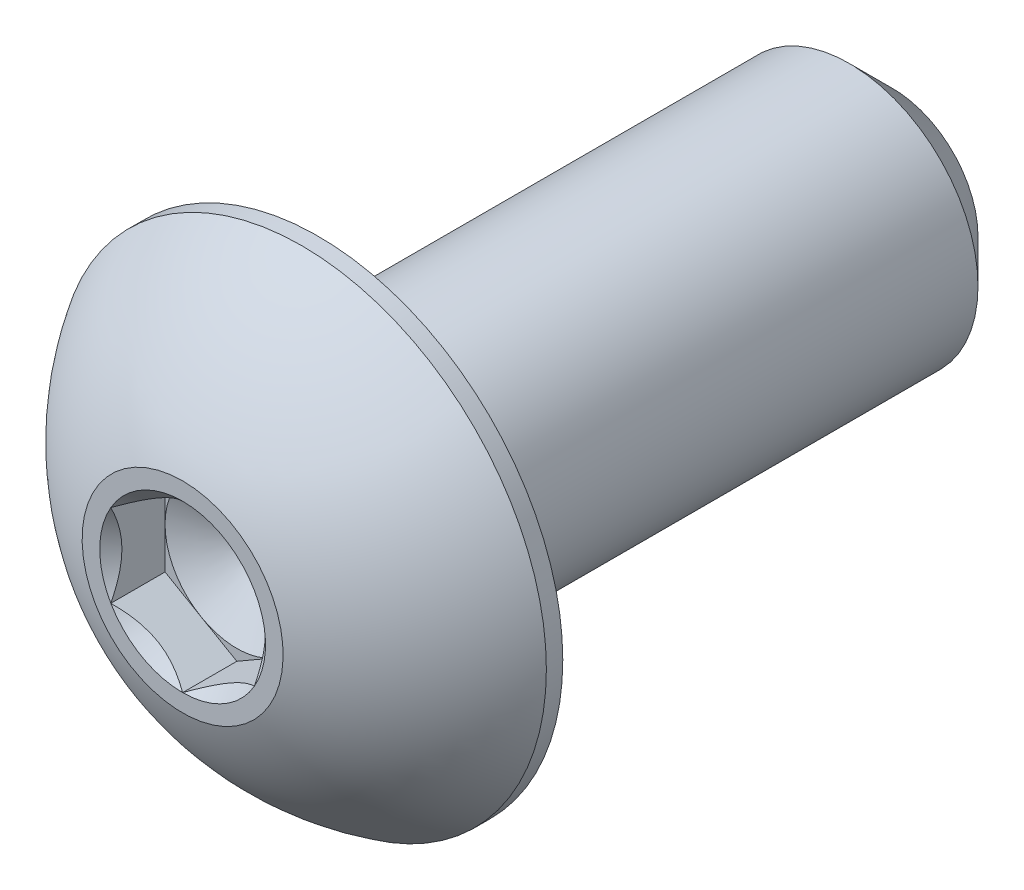
ISO-10303-21;
HEADER;
FILE_DESCRIPTION(('STEP AP214'),'2;1');
FILE_NAME('part.step','',(''),(''),'','','');
FILE_SCHEMA(('AUTOMOTIVE_DESIGN { 1 0 10303 214 1 1 1 1 }'));
ENDSEC;
DATA;
#1=APPLICATION_CONTEXT('core data for automotive mechanical design processes');
#2=APPLICATION_PROTOCOL_DEFINITION('international standard','automotive_design',2000,#1);
#3=PRODUCT_CONTEXT('',#1,'mechanical');
#4=PRODUCT('Part','Part','',(#3));
#5=PRODUCT_RELATED_PRODUCT_CATEGORY('part','',(#4));
#6=PRODUCT_DEFINITION_FORMATION('','',#4);
#7=PRODUCT_DEFINITION_CONTEXT('part definition',#1,'design');
#8=PRODUCT_DEFINITION('design','',#6,#7);
#9=PRODUCT_DEFINITION_SHAPE('','',#8);
#10=(LENGTH_UNIT() NAMED_UNIT(*) SI_UNIT(.MILLI.,.METRE.));
#11=(NAMED_UNIT(*) PLANE_ANGLE_UNIT() SI_UNIT($,.RADIAN.));
#12=(NAMED_UNIT(*) SI_UNIT($,.STERADIAN.) SOLID_ANGLE_UNIT());
#13=UNCERTAINTY_MEASURE_WITH_UNIT(LENGTH_MEASURE(1.E-05),#10,'distance_accuracy_value','');
#14=(GEOMETRIC_REPRESENTATION_CONTEXT(3) GLOBAL_UNCERTAINTY_ASSIGNED_CONTEXT((#13)) GLOBAL_UNIT_ASSIGNED_CONTEXT((#10,
#11,#12)) REPRESENTATION_CONTEXT('',''));
#15=CARTESIAN_POINT('',(0.,0.,0.));
#16=DIRECTION('',(0.,0.,1.));
#17=DIRECTION('',(1.,0.,0.));
#18=AXIS2_PLACEMENT_3D('',#15,#16,#17);
#19=CARTESIAN_POINT('',(0.,0.79375,3.9243));
#20=DIRECTION('',(0.,0.,-1.));
#21=DIRECTION('',(-1.,0.,0.));
#22=AXIS2_PLACEMENT_3D('',#19,#20,#21);
#23=PLANE('',#22);
#24=CARTESIAN_POINT('',(0.,0.,3.9243));
#25=DIRECTION('',(0.,0.,1.));
#26=DIRECTION('',(1.,0.,0.));
#27=AXIS2_PLACEMENT_3D('',#24,#25,#26);
#28=CIRCLE('',#27,1.11125);
#29=CARTESIAN_POINT('',(0.,1.11125,3.9243));
#30=VERTEX_POINT('',#29);
#31=EDGE_CURVE('E171',#30,#30,#28,.T.);
#32=ORIENTED_EDGE('',*,*,#31,.T.);
#33=EDGE_LOOP('',(#32));
#34=FACE_BOUND('',#33,.T.);
#35=CARTESIAN_POINT('',(0.,0.,3.9243));
#36=DIRECTION('',(0.,0.,1.));
#37=DIRECTION('',(1.,0.,0.));
#38=AXIS2_PLACEMENT_3D('',#35,#36,#37);
#39=CIRCLE('',#38,0.916543552338531);
#40=CARTESIAN_POINT('',(0.,0.916543552338531,3.9243));
#41=VERTEX_POINT('',#40);
#42=CARTESIAN_POINT('',(-0.79375,0.458271776169265,3.9243));
#43=VERTEX_POINT('',#42);
#44=EDGE_CURVE('E125',#41,#43,#39,.T.);
#45=ORIENTED_EDGE('',*,*,#44,.F.);
#46=CARTESIAN_POINT('',(0.,0.,3.9243));
#47=DIRECTION('',(0.,0.,1.));
#48=DIRECTION('',(1.,0.,0.));
#49=AXIS2_PLACEMENT_3D('',#46,#47,#48);
#50=CIRCLE('',#49,0.916543552338531);
#51=CARTESIAN_POINT('',(0.79375,0.458271776169266,3.9243));
#52=VERTEX_POINT('',#51);
#53=EDGE_CURVE('E110',#52,#41,#50,.T.);
#54=ORIENTED_EDGE('',*,*,#53,.F.);
#55=CARTESIAN_POINT('',(0.,0.,3.9243));
#56=DIRECTION('',(0.,0.,1.));
#57=DIRECTION('',(1.,0.,0.));
#58=AXIS2_PLACEMENT_3D('',#55,#56,#57);
#59=CIRCLE('',#58,0.916543552338531);
#60=CARTESIAN_POINT('',(0.79375,-0.458271776169265,3.9243));
#61=VERTEX_POINT('',#60);
#62=EDGE_CURVE('E121',#61,#52,#59,.T.);
#63=ORIENTED_EDGE('',*,*,#62,.F.);
#64=CARTESIAN_POINT('',(0.,0.,3.9243));
#65=DIRECTION('',(0.,0.,1.));
#66=DIRECTION('',(1.,0.,0.));
#67=AXIS2_PLACEMENT_3D('',#64,#65,#66);
#68=CIRCLE('',#67,0.916543552338531);
#69=CARTESIAN_POINT('',(0.,-0.916543552338531,3.9243));
#70=VERTEX_POINT('',#69);
#71=EDGE_CURVE('E142',#70,#61,#68,.T.);
#72=ORIENTED_EDGE('',*,*,#71,.F.);
#73=CARTESIAN_POINT('',(0.,0.,3.9243));
#74=DIRECTION('',(0.,0.,1.));
#75=DIRECTION('',(1.,0.,0.));
#76=AXIS2_PLACEMENT_3D('',#73,#74,#75);
#77=CIRCLE('',#76,0.916543552338531);
#78=CARTESIAN_POINT('',(-0.79375,-0.458271776169266,3.9243));
#79=VERTEX_POINT('',#78);
#80=EDGE_CURVE('E442',#79,#70,#77,.T.);
#81=ORIENTED_EDGE('',*,*,#80,.F.);
#82=CARTESIAN_POINT('',(0.,0.,3.9243));
#83=DIRECTION('',(0.,0.,1.));
#84=DIRECTION('',(1.,0.,0.));
#85=AXIS2_PLACEMENT_3D('',#82,#83,#84);
#86=CIRCLE('',#85,0.916543552338531);
#87=EDGE_CURVE('E451',#43,#79,#86,.T.);
#88=ORIENTED_EDGE('',*,*,#87,.F.);
#89=EDGE_LOOP('',(#45,#54,#63,#72,#81,#88));
#90=FACE_BOUND('',#89,.T.);
#91=ADVANCED_FACE('F37',(#34,#90),#23,.F.);
#92=CARTESIAN_POINT('',(0.,0.,-3.9243));
#93=DIRECTION('',(0.,0.,1.));
#94=DIRECTION('',(1.,0.,0.));
#95=AXIS2_PLACEMENT_3D('',#92,#93,#94);
#96=CONICAL_SURFACE('',#95,0.946150000000002,0.785398163397447);
#97=CARTESIAN_POINT('',(0.,0.,-3.44805));
#98=DIRECTION('',(0.,0.,1.));
#99=DIRECTION('',(1.,0.,0.));
#100=AXIS2_PLACEMENT_3D('',#97,#98,#99);
#101=CIRCLE('',#100,1.4224);
#102=CARTESIAN_POINT('',(1.4224,0.,-3.44805));
#103=VERTEX_POINT('',#102);
#104=EDGE_CURVE('E11',#103,#103,#101,.T.);
#105=ORIENTED_EDGE('',*,*,#104,.F.);
#106=EDGE_LOOP('',(#105));
#107=FACE_BOUND('',#106,.T.);
#108=CARTESIAN_POINT('',(0.,0.,-3.9243));
#109=DIRECTION('',(0.,0.,1.));
#110=DIRECTION('',(1.,0.,0.));
#111=AXIS2_PLACEMENT_3D('',#108,#109,#110);
#112=CIRCLE('',#111,0.946150000000002);
#113=CARTESIAN_POINT('',(0.946150000000002,0.,-3.9243));
#114=VERTEX_POINT('',#113);
#115=EDGE_CURVE('E164',#114,#114,#112,.T.);
#116=ORIENTED_EDGE('',*,*,#115,.T.);
#117=EDGE_LOOP('',(#116));
#118=FACE_BOUND('',#117,.T.);
#119=ADVANCED_FACE('F39',(#107,#118),#96,.T.);
#120=CARTESIAN_POINT('',(0.,0.,3.9243));
#121=DIRECTION('',(0.,0.,1.));
#122=DIRECTION('',(1.,0.,0.));
#123=AXIS2_PLACEMENT_3D('',#120,#121,#122);
#124=CYLINDRICAL_SURFACE('',#123,1.4224);
#125=CARTESIAN_POINT('',(0.,0.,2.4257));
#126=DIRECTION('',(0.,0.,1.));
#127=DIRECTION('',(1.,0.,0.));
#128=AXIS2_PLACEMENT_3D('',#125,#126,#127);
#129=CIRCLE('',#128,1.4224);
#130=CARTESIAN_POINT('',(1.4224,0.,2.4257));
#131=VERTEX_POINT('',#130);
#132=EDGE_CURVE('E45',#131,#131,#129,.T.);
#133=ORIENTED_EDGE('',*,*,#132,.F.);
#134=EDGE_LOOP('',(#133));
#135=FACE_BOUND('',#134,.T.);
#136=ORIENTED_EDGE('',*,*,#104,.T.);
#137=EDGE_LOOP('',(#136));
#138=FACE_BOUND('',#137,.T.);
#139=ADVANCED_FACE('F185',(#135,#138),#124,.T.);
#140=CARTESIAN_POINT('',(0.,2.7051,2.4257));
#141=DIRECTION('',(0.,0.,1.));
#142=DIRECTION('',(1.,0.,0.));
#143=AXIS2_PLACEMENT_3D('',#140,#141,#142);
#144=PLANE('',#143);
#145=CARTESIAN_POINT('',(0.,0.,2.4257));
#146=DIRECTION('',(0.,0.,1.));
#147=DIRECTION('',(1.,0.,0.));
#148=AXIS2_PLACEMENT_3D('',#145,#146,#147);
#149=CIRCLE('',#148,2.7051);
#150=CARTESIAN_POINT('',(2.7051,0.,2.4257));
#151=VERTEX_POINT('',#150);
#152=EDGE_CURVE('E178',#151,#151,#149,.T.);
#153=ORIENTED_EDGE('',*,*,#152,.F.);
#154=EDGE_LOOP('',(#153));
#155=FACE_BOUND('',#154,.T.);
#156=ORIENTED_EDGE('',*,*,#132,.T.);
#157=EDGE_LOOP('',(#156));
#158=FACE_BOUND('',#157,.T.);
#159=ADVANCED_FACE('F183',(#155,#158),#144,.F.);
#160=CARTESIAN_POINT('',(0.,0.,3.9243));
#161=DIRECTION('',(0.,0.,1.));
#162=DIRECTION('',(1.,0.,0.));
#163=AXIS2_PLACEMENT_3D('',#160,#161,#162);
#164=CYLINDRICAL_SURFACE('',#163,2.7051);
#165=CARTESIAN_POINT('',(0.,0.,2.60712857142857));
#166=DIRECTION('',(0.,0.,1.));
#167=DIRECTION('',(1.,0.,0.));
#168=AXIS2_PLACEMENT_3D('',#165,#166,#167);
#169=CIRCLE('',#168,2.7051);
#170=CARTESIAN_POINT('',(0.,2.7051,2.60712857142857));
#171=VERTEX_POINT('',#170);
#172=EDGE_CURVE('E175',#171,#171,#169,.T.);
#173=ORIENTED_EDGE('',*,*,#172,.F.);
#174=EDGE_LOOP('',(#173));
#175=FACE_BOUND('',#174,.T.);
#176=ORIENTED_EDGE('',*,*,#152,.T.);
#177=EDGE_LOOP('',(#176));
#178=FACE_BOUND('',#177,.T.);
#179=ADVANCED_FACE('F204',(#175,#178),#164,.T.);
#180=CARTESIAN_POINT('',(0.,0.,0.956717402105471));
#181=DIRECTION('',(0.,0.,1.));
#182=DIRECTION('',(0.,1.,0.));
#183=AXIS2_PLACEMENT_3D('',#180,#181,#182);
#184=SPHERICAL_SURFACE('',#183,3.16882044897253);
#185=CARTESIAN_POINT('',(0.,1.11125,3.9243));
#186=CARTESIAN_POINT('',(0.,1.13179667759226,3.9166060663439));
#187=CARTESIAN_POINT('',(0.,1.15226342355972,3.90869867966255));
#188=CARTESIAN_POINT('',(0.,1.19302827978612,3.89246055572916));
#189=CARTESIAN_POINT('',(0.,1.21332639004505,3.88412981847711));
#190=CARTESIAN_POINT('',(0.,1.25374520239545,3.86704854888208));
#191=CARTESIAN_POINT('',(0.,1.27386590448691,3.8582980165391));
#192=CARTESIAN_POINT('',(0.,1.31392122407572,3.84038094229067));
#193=CARTESIAN_POINT('',(0.,1.33385584157306,3.83121440038521));
#194=CARTESIAN_POINT('',(0.,1.37353039060482,3.81246925890343));
#195=CARTESIAN_POINT('',(0.,1.39327032213924,3.80289065932711));
#196=CARTESIAN_POINT('',(0.,1.43254698326807,3.78332553568027));
#197=CARTESIAN_POINT('',(0.,1.45208371286248,3.77333901160976));
#198=CARTESIAN_POINT('',(0.,1.49094554142533,3.75296234719803));
#199=CARTESIAN_POINT('',(0.,1.51027064039377,3.7425722068568));
#200=CARTESIAN_POINT('',(0.,1.54870087042163,3.72139279250897));
#201=CARTESIAN_POINT('',(0.,1.56780600148105,3.71060351850236));
#202=CARTESIAN_POINT('',(0.,1.60578805328026,3.6886304915572));
#203=CARTESIAN_POINT('',(0.,1.62466497402005,3.67744673861865));
#204=CARTESIAN_POINT('',(0.,1.66218246123194,3.65468957874866));
#205=CARTESIAN_POINT('',(0.,1.68082302770403,3.64311617181724));
#206=CARTESIAN_POINT('',(0.,1.71785976439932,3.61958469700166));
#207=CARTESIAN_POINT('',(0.,1.73625593462253,3.60762662911752));
#208=CARTESIAN_POINT('',(0.,1.77279594227768,3.5833309913898));
#209=CARTESIAN_POINT('',(0.,1.79093977970964,3.57099342154623));
#210=CARTESIAN_POINT('',(0.,1.82696729410213,3.5459441026187));
#211=CARTESIAN_POINT('',(0.,1.84485097106267,3.53323235353474));
#212=CARTESIAN_POINT('',(0.,1.88035044907158,3.50744016027535));
#213=CARTESIAN_POINT('',(0.,1.89796625011995,3.49435971609992));
#214=CARTESIAN_POINT('',(0.,1.93292237643174,3.46783577587022));
#215=CARTESIAN_POINT('',(0.,1.95026270169517,3.45439227981596));
#216=CARTESIAN_POINT('',(0.,1.98466039541108,3.42714803567043));
#217=CARTESIAN_POINT('',(0.,2.00171776386356,3.41334728757917));
#218=CARTESIAN_POINT('',(0.,2.03554218500583,3.38539449332841));
#219=CARTESIAN_POINT('',(0.,2.05230923769562,3.37124244716892));
#220=CARTESIAN_POINT('',(0.,2.08554579360982,3.3425931623088));
#221=CARTESIAN_POINT('',(0.,2.10201529683424,3.32809592360816));
#222=CARTESIAN_POINT('',(0.,2.13464964848491,3.29876250811703));
#223=CARTESIAN_POINT('',(0.,2.15081449691115,3.28392633132654));
#224=CARTESIAN_POINT('',(0.,2.18283256506795,3.25392144033288));
#225=CARTESIAN_POINT('',(0.,2.19868578479851,3.23875272612972));
#226=CARTESIAN_POINT('',(0.,2.23007375611036,3.2080893044524));
#227=CARTESIAN_POINT('',(0.,2.24560850769166,3.19259459697825));
#228=CARTESIAN_POINT('',(0.,2.27635284064621,3.16128587354188));
#229=CARTESIAN_POINT('',(0.,2.29156242201947,3.14547185757967));
#230=CARTESIAN_POINT('',(0.,2.32164985278493,3.11353133970713));
#231=CARTESIAN_POINT('',(0.,2.33652770217713,3.0974048377968));
#232=CARTESIAN_POINT('',(0.,2.3659452503257,3.06484630538257));
#233=CARTESIAN_POINT('',(0.,2.38048494908206,3.04841427487866));
#234=CARTESIAN_POINT('',(0.,2.40921992318589,3.01525177444122));
#235=CARTESIAN_POINT('',(0.,2.42341519853336,2.9985213045077));
#236=CARTESIAN_POINT('',(0.,2.45145520165522,2.96476914313931));
#237=CARTESIAN_POINT('',(0.,2.4652999294296,2.94774745170446));
#238=CARTESIAN_POINT('',(0.,2.49263286441426,2.91342019086236));
#239=CARTESIAN_POINT('',(0.,2.50612107162454,2.89611462145512));
#240=CARTESIAN_POINT('',(0.,2.53273514653018,2.86122707081507));
#241=CARTESIAN_POINT('',(0.,2.54586101422555,2.84364508958227));
#242=CARTESIAN_POINT('',(0.,2.57174474661843,2.80821230014283));
#243=CARTESIAN_POINT('',(0.,2.58450261131594,2.7903614919362));
#244=CARTESIAN_POINT('',(0.,2.60964483618243,2.75439875141566));
#245=CARTESIAN_POINT('',(0.,2.62202919635141,2.73628681910174));
#246=CARTESIAN_POINT('',(0.,2.64641905987448,2.69980963828797));
#247=CARTESIAN_POINT('',(0.,2.65842456322856,2.68144438978811));
#248=CARTESIAN_POINT('',(0.,2.68205156867364,2.64446852217512));
#249=CARTESIAN_POINT('',(0.,2.69367307076464,2.62585790306199));
#250=CARTESIAN_POINT('',(0.,2.7051,2.60712857142857));
#251=B_SPLINE_CURVE_WITH_KNOTS('',3,(#185,#186,#187,#188,#189,#190,#191,#192,#193,#194,#195,
#196,#197,#198,#199,#200,#201,#202,#203,#204,#205,#206,#207,#208,#209,#210,#211,#212,#213,#214,
#215,#216,#217,#218,#219,#220,#221,#222,#223,#224,#225,#226,#227,#228,#229,#230,#231,#232,#233,
#234,#235,#236,#237,#238,#239,#240,#241,#242,#243,#244,#245,#246,#247,#248,#249,#250),
.UNSPECIFIED.,.F.,.F.,(4,2,2,2,2,2,2,2,2,2,2,2,2,2,2,2,2,2,2,2,2,2,2,2,2,2,2,2,2,2,2,2,4),(0.,
0.0658187445891959,0.131637489178392,0.197456233767589,0.263274978356786,0.329093722945982,
0.394912467535178,0.460731212124375,0.526549956713571,0.592368701302768,0.658187445891964,
0.72400619048116,0.789824935070357,0.855643679659553,0.92146242424875,0.987281168837946,
1.05309991342714,1.11891865801634,1.18473740260554,1.25055614719473,1.31637489178393,
1.38219363637312,1.44801238096232,1.51383112555152,1.57964987014071,1.64546861472991,
1.71128735931911,1.7771061039083,1.8429248484975,1.9087435930867,1.97456233767589,
2.04038108226509,2.10619982685429),.UNSPECIFIED.);
#252=EDGE_CURVE('BSEAM196',#30,#171,#251,.T.);
#253=ORIENTED_EDGE('',*,*,#31,.F.);
#254=ORIENTED_EDGE('',*,*,#172,.T.);
#255=ORIENTED_EDGE('',*,*,#252,.T.);
#256=ORIENTED_EDGE('',*,*,#252,.F.);
#257=EDGE_LOOP('',(#253,#255,#254,#256));
#258=FACE_BOUND('',#257,.T.);
#259=ADVANCED_FACE('F196',(#258),#184,.T.);
#260=CARTESIAN_POINT('',(0.,0.946150000000002,-3.9243));
#261=DIRECTION('',(0.,0.,1.));
#262=DIRECTION('',(1.,0.,0.));
#263=AXIS2_PLACEMENT_3D('',#260,#261,#262);
#264=PLANE('',#263);
#265=ORIENTED_EDGE('',*,*,#115,.F.);
#266=EDGE_LOOP('',(#265));
#267=FACE_BOUND('',#266,.T.);
#268=ADVANCED_FACE('F194',(#267),#264,.F.);
#269=CARTESIAN_POINT('',(0.79375,0.458271776169266,3.9243));
#270=DIRECTION('',(-0.499999999999999,-0.866025403784439,0.));
#271=DIRECTION('',(0.866025403784439,-0.5,0.));
#272=AXIS2_PLACEMENT_3D('',#269,#270,#271);
#273=PLANE('',#272);
#274=CARTESIAN_POINT('',(0.79395,0.458156306115428,3.9244154918722));
#275=CARTESIAN_POINT('',(0.7666563268291,0.473914315667821,3.90866677881996));
#276=CARTESIAN_POINT('',(0.738906237701708,0.489935837095556,3.89384254758418));
#277=CARTESIAN_POINT('',(0.68232025046316,0.522605772060093,3.86669903778594));
#278=CARTESIAN_POINT('',(0.653478963353311,0.539257296936739,3.85439487372838));
#279=CARTESIAN_POINT('',(0.595321679020445,0.572834420701657,3.8333173665706));
#280=CARTESIAN_POINT('',(0.56602051479722,0.589751455753505,3.82449100814755));
#281=CARTESIAN_POINT('',(0.506773157113024,0.62395793366125,3.81089123872424));
#282=CARTESIAN_POINT('',(0.476828775638362,0.641246330366363,3.80610766812998));
#283=CARTESIAN_POINT('',(0.425225377533548,0.671039566153277,3.80179340945595));
#284=CARTESIAN_POINT('',(0.403633531741488,0.683505624133623,3.80115527141097));
#285=CARTESIAN_POINT('',(0.360491632722968,0.708413611145317,3.80222613979119));
#286=CARTESIAN_POINT('',(0.338941589763515,0.720855534249006,3.80393566388179));
#287=CARTESIAN_POINT('',(0.274599154455217,0.758003656594567,3.81247279115859));
#288=CARTESIAN_POINT('',(0.232126946019305,0.782524997568119,3.82270991913679));
#289=CARTESIAN_POINT('',(0.157575609219718,0.825567231937807,3.84741858984055));
#290=CARTESIAN_POINT('',(0.125147212182333,0.844289775696729,3.86059617467531));
#291=CARTESIAN_POINT('',(0.0615608535385161,0.881001376976525,3.89028103995168));
#292=CARTESIAN_POINT('',(0.0303991453684825,0.898992597576902,3.90677748789317));
#293=CARTESIAN_POINT('',(-0.000200000000000446,0.916659022392369,3.9244154918722));
#294=B_SPLINE_CURVE_WITH_KNOTS('',3,(#274,#275,#276,#277,#278,#279,#280,#281,#282,#283,#284,
#285,#286,#287,#288,#289,#290,#291,#292,#293),.UNSPECIFIED.,.F.,.F.,(4,2,2,2,2,2,2,2,2,4),(0.,
0.105768699105621,0.21215429718622,0.316848842533858,0.421279499712345,0.495991864977073,
0.570720707151283,0.720221070373883,0.839150369964801,0.957697614118391),.UNSPECIFIED.);
#295=EDGE_CURVE('E107',#52,#41,#294,.T.);
#296=ORIENTED_EDGE('',*,*,#295,.T.);
#297=DIRECTION('',(0.,0.,-1.));
#298=VECTOR('',#297,1.);
#299=CARTESIAN_POINT('',(0.,0.916543552338531,3.9243));
#300=LINE('',#299,#298);
#301=CARTESIAN_POINT('',(0.,0.916543552338531,3.32486));
#302=VERTEX_POINT('',#301);
#303=EDGE_CURVE('E162',#41,#302,#300,.T.);
#304=ORIENTED_EDGE('',*,*,#303,.T.);
#305=DIRECTION('',(-0.866025403784439,0.499999999999999,0.));
#306=VECTOR('',#305,1.);
#307=CARTESIAN_POINT('',(0.79375,0.458271776169266,3.32486));
#308=LINE('',#307,#306);
#309=CARTESIAN_POINT('',(0.396875,0.687407664253898,3.32486));
#310=VERTEX_POINT('',#309);
#311=EDGE_CURVE('E478',#310,#302,#308,.T.);
#312=ORIENTED_EDGE('',*,*,#311,.F.);
#313=CARTESIAN_POINT('',(0.79375,0.458271776169266,3.32486));
#314=VERTEX_POINT('',#313);
#315=EDGE_CURVE('E52',#314,#310,#308,.T.);
#316=ORIENTED_EDGE('',*,*,#315,.F.);
#317=DIRECTION('',(0.,0.,-1.));
#318=VECTOR('',#317,1.);
#319=CARTESIAN_POINT('',(0.79375,0.458271776169266,3.9243));
#320=LINE('',#319,#318);
#321=EDGE_CURVE('E138',#52,#314,#320,.T.);
#322=ORIENTED_EDGE('',*,*,#321,.F.);
#323=EDGE_LOOP('',(#296,#304,#312,#316,#322));
#324=FACE_BOUND('',#323,.T.);
#325=ADVANCED_FACE('F144',(#324),#273,.T.);
#326=CARTESIAN_POINT('',(0.,0.916543552338531,3.9243));
#327=DIRECTION('',(0.5,-0.866025403784438,0.));
#328=DIRECTION('',(0.866025403784438,0.500000000000001,0.));
#329=AXIS2_PLACEMENT_3D('',#326,#327,#328);
#330=PLANE('',#329);
#331=CARTESIAN_POINT('',(0.000199999999999363,0.916659022392369,3.9244154918722));
#332=CARTESIAN_POINT('',(-0.0270936731709006,0.900901012839976,3.90866677881996));
#333=CARTESIAN_POINT('',(-0.0548437622982919,0.88487949141224,3.89384254758418));
#334=CARTESIAN_POINT('',(-0.111429749536841,0.852209556447703,3.86669903778594));
#335=CARTESIAN_POINT('',(-0.140271036646689,0.835558031571057,3.85439487372838));
#336=CARTESIAN_POINT('',(-0.198428320979556,0.801980907806139,3.8333173665706));
#337=CARTESIAN_POINT('',(-0.22772948520278,0.785063872754291,3.82449100814755));
#338=CARTESIAN_POINT('',(-0.286976842886977,0.750857394846546,3.81089123872424));
#339=CARTESIAN_POINT('',(-0.316921224361638,0.733568998141434,3.80610766812998));
#340=CARTESIAN_POINT('',(-0.368524622466453,0.703775762354519,3.80179340945595));
#341=CARTESIAN_POINT('',(-0.390116468258512,0.691309704374173,3.80115527141097));
#342=CARTESIAN_POINT('',(-0.433258367277032,0.666401717362479,3.80222613979119));
#343=CARTESIAN_POINT('',(-0.454808410236485,0.65395979425879,3.80393566388179));
#344=CARTESIAN_POINT('',(-0.519150845544783,0.616811671913228,3.81247279115859));
#345=CARTESIAN_POINT('',(-0.561623053980696,0.592290330939676,3.82270991913679));
#346=CARTESIAN_POINT('',(-0.636174390780282,0.549248096569989,3.84741858984055));
#347=CARTESIAN_POINT('',(-0.668602787817667,0.530525552811066,3.86059617467531));
#348=CARTESIAN_POINT('',(-0.732189146461484,0.493813951531271,3.89028103995168));
#349=CARTESIAN_POINT('',(-0.763350854631517,0.475822730930893,3.90677748789317));
#350=CARTESIAN_POINT('',(-0.79395,0.458156306115427,3.9244154918722));
#351=B_SPLINE_CURVE_WITH_KNOTS('',3,(#331,#332,#333,#334,#335,#336,#337,#338,#339,#340,#341,
#342,#343,#344,#345,#346,#347,#348,#349,#350),.UNSPECIFIED.,.F.,.F.,(4,2,2,2,2,2,2,2,2,4),(0.,
0.105768699105621,0.21215429718622,0.316848842533859,0.421279499712346,0.495991864977073,
0.570720707151283,0.720221070373883,0.839150369964801,0.95769761411839),.UNSPECIFIED.);
#352=EDGE_CURVE('E466',#41,#43,#351,.T.);
#353=ORIENTED_EDGE('',*,*,#352,.T.);
#354=DIRECTION('',(0.,0.,-1.));
#355=VECTOR('',#354,1.);
#356=CARTESIAN_POINT('',(-0.79375,0.458271776169265,3.9243));
#357=LINE('',#356,#355);
#358=CARTESIAN_POINT('',(-0.79375,0.458271776169265,3.32486));
#359=VERTEX_POINT('',#358);
#360=EDGE_CURVE('E159',#43,#359,#357,.T.);
#361=ORIENTED_EDGE('',*,*,#360,.T.);
#362=DIRECTION('',(-0.866025403784438,-0.5,0.));
#363=VECTOR('',#362,1.);
#364=CARTESIAN_POINT('',(0.,0.916543552338531,3.32486));
#365=LINE('',#364,#363);
#366=CARTESIAN_POINT('',(-0.396875,0.687407664253898,3.32486));
#367=VERTEX_POINT('',#366);
#368=EDGE_CURVE('E480',#367,#359,#365,.T.);
#369=ORIENTED_EDGE('',*,*,#368,.F.);
#370=EDGE_CURVE('E481',#302,#367,#365,.T.);
#371=ORIENTED_EDGE('',*,*,#370,.F.);
#372=ORIENTED_EDGE('',*,*,#303,.F.);
#373=EDGE_LOOP('',(#353,#361,#369,#371,#372));
#374=FACE_BOUND('',#373,.T.);
#375=ADVANCED_FACE('F202',(#374),#330,.T.);
#376=CARTESIAN_POINT('',(-0.79375,0.458271776169265,3.9243));
#377=DIRECTION('',(1.,0.,0.));
#378=DIRECTION('',(0.,1.,0.));
#379=AXIS2_PLACEMENT_3D('',#376,#377,#378);
#380=PLANE('',#379);
#381=CARTESIAN_POINT('',(-0.79375,-0.886414096599244,4.19761736942916));
#382=CARTESIAN_POINT('',(-0.79375,-0.86470171419992,4.18144470678827));
#383=CARTESIAN_POINT('',(-0.79375,-0.842865388063719,4.16543885240306));
#384=CARTESIAN_POINT('',(-0.79375,-0.79889567409347,4.13382876580154));
#385=CARTESIAN_POINT('',(-0.79375,-0.776762210654221,4.11822463886703));
#386=CARTESIAN_POINT('',(-0.79375,-0.709518845973245,4.07189483271595));
#387=CARTESIAN_POINT('',(-0.79375,-0.66389615563468,4.04190094914757));
#388=CARTESIAN_POINT('',(-0.79375,-0.568400086548212,3.98326512389417));
#389=CARTESIAN_POINT('',(-0.79375,-0.518429613643662,3.95477938225233));
#390=CARTESIAN_POINT('',(-0.79375,-0.416032101977318,3.90284504880168));
#391=CARTESIAN_POINT('',(-0.79375,-0.363614070820858,3.87937952562059));
#392=CARTESIAN_POINT('',(-0.79375,-0.284656617559875,3.85068367250404));
#393=CARTESIAN_POINT('',(-0.79375,-0.259232429165401,3.84240416001904));
#394=CARTESIAN_POINT('',(-0.79375,-0.207807364053749,3.8278843748874));
#395=CARTESIAN_POINT('',(-0.79375,-0.18180644548624,3.82164425074902));
#396=CARTESIAN_POINT('',(-0.79375,-0.104000822329058,3.80670941347527));
#397=CARTESIAN_POINT('',(-0.79375,-0.0514629352178519,3.80143917525149));
#398=CARTESIAN_POINT('',(-0.79375,0.0519230063012085,3.80157298750897));
#399=CARTESIAN_POINT('',(-0.79375,0.102771763174832,3.80664351587352));
#400=CARTESIAN_POINT('',(-0.79375,0.178135386060792,3.82085873388841));
#401=CARTESIAN_POINT('',(-0.79375,0.20332427883755,3.82678165958048));
#402=CARTESIAN_POINT('',(-0.79375,0.253165828732923,3.84056036344039));
#403=CARTESIAN_POINT('',(-0.79375,0.277818539396018,3.84841594763457));
#404=CARTESIAN_POINT('',(-0.79375,0.356745861124012,3.87648863718015));
#405=CARTESIAN_POINT('',(-0.79375,0.409857837794497,3.89995804225391));
#406=CARTESIAN_POINT('',(-0.79375,0.513576140604894,3.95209685067416));
#407=CARTESIAN_POINT('',(-0.79375,0.564172447910597,3.98078520882156));
#408=CARTESIAN_POINT('',(-0.79375,0.660846745738733,4.0399268692853));
#409=CARTESIAN_POINT('',(-0.79375,0.707024109054009,4.07021975969034));
#410=CARTESIAN_POINT('',(-0.79375,0.775058121051357,4.11703034954389));
#411=CARTESIAN_POINT('',(-0.79375,0.797441820874697,4.13279526319896));
#412=CARTESIAN_POINT('',(-0.79375,0.841904444862721,4.16473700714118));
#413=CARTESIAN_POINT('',(-0.79375,0.863983450465099,4.18091372394077));
#414=CARTESIAN_POINT('',(-0.79375,0.885935743338028,4.19726105203419));
#415=B_SPLINE_CURVE_WITH_KNOTS('',3,(#381,#382,#383,#384,#385,#386,#387,#388,#389,#390,#391,
#392,#393,#394,#395,#396,#397,#398,#399,#400,#401,#402,#403,#404,#405,#406,#407,#408,#409,#410,
#411,#412,#413,#414),.UNSPECIFIED.,.F.,.F.,(4,2,2,2,2,2,2,2,2,2,2,2,2,2,2,2,4),(0.,
0.0812188387950317,0.162458750511489,0.326178806253456,0.498586653888075,0.670403531438169,
0.750543907216537,0.830690117517372,0.988028410529606,1.14037233605713,1.21793318643015,
1.29548625548648,1.46917505876894,1.64350775825017,1.80910713566105,1.89123846739721,
1.97334740474278),.UNSPECIFIED.);
#416=EDGE_CURVE('E459',#43,#79,#415,.F.);
#417=ORIENTED_EDGE('',*,*,#416,.T.);
#418=DIRECTION('',(0.,0.,-1.));
#419=VECTOR('',#418,1.);
#420=CARTESIAN_POINT('',(-0.79375,-0.458271776169266,3.9243));
#421=LINE('',#420,#419);
#422=CARTESIAN_POINT('',(-0.79375,-0.458271776169266,3.32486));
#423=VERTEX_POINT('',#422);
#424=EDGE_CURVE('E156',#79,#423,#421,.T.);
#425=ORIENTED_EDGE('',*,*,#424,.T.);
#426=DIRECTION('',(0.,-1.,0.));
#427=VECTOR('',#426,1.);
#428=CARTESIAN_POINT('',(-0.79375,0.458271776169265,3.32486));
#429=LINE('',#428,#427);
#430=CARTESIAN_POINT('',(-0.79375,0.,3.32486));
#431=VERTEX_POINT('',#430);
#432=EDGE_CURVE('E484',#431,#423,#429,.T.);
#433=ORIENTED_EDGE('',*,*,#432,.F.);
#434=EDGE_CURVE('E485',#359,#431,#429,.T.);
#435=ORIENTED_EDGE('',*,*,#434,.F.);
#436=ORIENTED_EDGE('',*,*,#360,.F.);
#437=EDGE_LOOP('',(#417,#425,#433,#435,#436));
#438=FACE_BOUND('',#437,.T.);
#439=ADVANCED_FACE('F323',(#438),#380,.T.);
#440=CARTESIAN_POINT('',(-0.79375,-0.458271776169266,3.9243));
#441=DIRECTION('',(0.499999999999999,0.866025403784439,0.));
#442=DIRECTION('',(-0.866025403784439,0.5,0.));
#443=AXIS2_PLACEMENT_3D('',#440,#441,#442);
#444=PLANE('',#443);
#445=CARTESIAN_POINT('',(-0.79395,-0.458156306115428,3.9244154918722));
#446=CARTESIAN_POINT('',(-0.7666563268291,-0.473914315667821,3.90866677881996));
#447=CARTESIAN_POINT('',(-0.738906237701709,-0.489935837095556,3.89384254758418));
#448=CARTESIAN_POINT('',(-0.68232025046316,-0.522605772060093,3.86669903778594));
#449=CARTESIAN_POINT('',(-0.653478963353312,-0.539257296936739,3.85439487372838));
#450=CARTESIAN_POINT('',(-0.595321679020445,-0.572834420701657,3.8333173665706));
#451=CARTESIAN_POINT('',(-0.56602051479722,-0.589751455753506,3.82449100814755));
#452=CARTESIAN_POINT('',(-0.506773157113024,-0.623957933661251,3.81089123872424));
#453=CARTESIAN_POINT('',(-0.476828775638362,-0.641246330366363,3.80610766812998));
#454=CARTESIAN_POINT('',(-0.425225377533548,-0.671039566153277,3.80179340945595));
#455=CARTESIAN_POINT('',(-0.403633531741488,-0.683505624133623,3.80115527141097));
#456=CARTESIAN_POINT('',(-0.360491632722968,-0.708413611145318,3.80222613979119));
#457=CARTESIAN_POINT('',(-0.338941589763515,-0.720855534249006,3.80393566388179));
#458=CARTESIAN_POINT('',(-0.274599154455217,-0.758003656594568,3.81247279115859));
#459=CARTESIAN_POINT('',(-0.232126946019305,-0.78252499756812,3.82270991913679));
#460=CARTESIAN_POINT('',(-0.157575609219718,-0.825567231937807,3.84741858984055));
#461=CARTESIAN_POINT('',(-0.125147212182333,-0.84428977569673,3.86059617467531));
#462=CARTESIAN_POINT('',(-0.0615608535385163,-0.881001376976525,3.89028103995168));
#463=CARTESIAN_POINT('',(-0.0303991453684828,-0.898992597576903,3.90677748789317));
#464=CARTESIAN_POINT('',(0.00020000000000017,-0.916659022392369,3.9244154918722));
#465=B_SPLINE_CURVE_WITH_KNOTS('',3,(#445,#446,#447,#448,#449,#450,#451,#452,#453,#454,#455,
#456,#457,#458,#459,#460,#461,#462,#463,#464),.UNSPECIFIED.,.F.,.F.,(4,2,2,2,2,2,2,2,2,4),(0.,
0.105768699105621,0.21215429718622,0.316848842533859,0.421279499712346,0.495991864977074,
0.570720707151283,0.720221070373884,0.839150369964801,0.957697614118391),.UNSPECIFIED.);
#466=EDGE_CURVE('E444',#79,#70,#465,.T.);
#467=ORIENTED_EDGE('',*,*,#466,.T.);
#468=DIRECTION('',(0.,0.,-1.));
#469=VECTOR('',#468,1.);
#470=CARTESIAN_POINT('',(0.,-0.916543552338531,3.9243));
#471=LINE('',#470,#469);
#472=CARTESIAN_POINT('',(0.,-0.916543552338531,3.32486));
#473=VERTEX_POINT('',#472);
#474=EDGE_CURVE('E147',#70,#473,#471,.T.);
#475=ORIENTED_EDGE('',*,*,#474,.T.);
#476=DIRECTION('',(0.866025403784439,-0.499999999999999,0.));
#477=VECTOR('',#476,1.);
#478=CARTESIAN_POINT('',(-0.79375,-0.458271776169266,3.32486));
#479=LINE('',#478,#477);
#480=CARTESIAN_POINT('',(-0.396875,-0.687407664253899,3.32486));
#481=VERTEX_POINT('',#480);
#482=EDGE_CURVE('E488',#481,#473,#479,.T.);
#483=ORIENTED_EDGE('',*,*,#482,.F.);
#484=EDGE_CURVE('E489',#423,#481,#479,.T.);
#485=ORIENTED_EDGE('',*,*,#484,.F.);
#486=ORIENTED_EDGE('',*,*,#424,.F.);
#487=EDGE_LOOP('',(#467,#475,#483,#485,#486));
#488=FACE_BOUND('',#487,.T.);
#489=ADVANCED_FACE('F333',(#488),#444,.T.);
#490=CARTESIAN_POINT('',(0.,-0.916543552338531,3.9243));
#491=DIRECTION('',(-0.5,0.866025403784439,0.));
#492=DIRECTION('',(-0.866025403784439,-0.5,0.));
#493=AXIS2_PLACEMENT_3D('',#490,#491,#492);
#494=PLANE('',#493);
#495=CARTESIAN_POINT('',(-0.000199999999999494,-0.916659022392369,3.9244154918722));
#496=CARTESIAN_POINT('',(0.0270936731709003,-0.900901012839976,3.90866677881996));
#497=CARTESIAN_POINT('',(0.0548437622982917,-0.884879491412241,3.89384254758418));
#498=CARTESIAN_POINT('',(0.111429749536841,-0.852209556447704,3.86669903778594));
#499=CARTESIAN_POINT('',(0.140271036646689,-0.835558031571057,3.85439487372838));
#500=CARTESIAN_POINT('',(0.198428320979556,-0.801980907806139,3.8333173665706));
#501=CARTESIAN_POINT('',(0.22772948520278,-0.785063872754291,3.82449100814755));
#502=CARTESIAN_POINT('',(0.286976842886977,-0.750857394846546,3.81089123872424));
#503=CARTESIAN_POINT('',(0.316921224361638,-0.733568998141434,3.80610766812998));
#504=CARTESIAN_POINT('',(0.368524622466453,-0.703775762354519,3.80179340945595));
#505=CARTESIAN_POINT('',(0.390116468258512,-0.691309704374173,3.80115527141097));
#506=CARTESIAN_POINT('',(0.433258367277032,-0.666401717362479,3.80222613979119));
#507=CARTESIAN_POINT('',(0.454808410236485,-0.65395979425879,3.80393566388179));
#508=CARTESIAN_POINT('',(0.519150845544784,-0.616811671913228,3.8124727911586));
#509=CARTESIAN_POINT('',(0.561623053980696,-0.592290330939676,3.82270991913679));
#510=CARTESIAN_POINT('',(0.636174390780282,-0.549248096569989,3.84741858984055));
#511=CARTESIAN_POINT('',(0.668602787817668,-0.530525552811066,3.86059617467531));
#512=CARTESIAN_POINT('',(0.732189146461484,-0.493813951531271,3.89028103995168));
#513=CARTESIAN_POINT('',(0.763350854631517,-0.475822730930894,3.90677748789317));
#514=CARTESIAN_POINT('',(0.79395,-0.458156306115427,3.9244154918722));
#515=B_SPLINE_CURVE_WITH_KNOTS('',3,(#495,#496,#497,#498,#499,#500,#501,#502,#503,#504,#505,
#506,#507,#508,#509,#510,#511,#512,#513,#514),.UNSPECIFIED.,.F.,.F.,(4,2,2,2,2,2,2,2,2,4),(0.,
0.105768699105621,0.21215429718622,0.316848842533859,0.421279499712346,0.495991864977073,
0.570720707151283,0.720221070373884,0.839150369964801,0.95769761411839),.UNSPECIFIED.);
#516=EDGE_CURVE('E435',#70,#61,#515,.T.);
#517=ORIENTED_EDGE('',*,*,#516,.T.);
#518=DIRECTION('',(0.,0.,-1.));
#519=VECTOR('',#518,1.);
#520=CARTESIAN_POINT('',(0.79375,-0.458271776169265,3.9243));
#521=LINE('',#520,#519);
#522=CARTESIAN_POINT('',(0.79375,-0.458271776169265,3.32486));
#523=VERTEX_POINT('',#522);
#524=EDGE_CURVE('E141',#61,#523,#521,.T.);
#525=ORIENTED_EDGE('',*,*,#524,.T.);
#526=DIRECTION('',(0.866025403784438,0.5,0.));
#527=VECTOR('',#526,1.);
#528=CARTESIAN_POINT('',(0.,-0.916543552338531,3.32486));
#529=LINE('',#528,#527);
#530=CARTESIAN_POINT('',(0.396875,-0.687407664253898,3.32486));
#531=VERTEX_POINT('',#530);
#532=EDGE_CURVE('E491',#531,#523,#529,.T.);
#533=ORIENTED_EDGE('',*,*,#532,.F.);
#534=EDGE_CURVE('E492',#473,#531,#529,.T.);
#535=ORIENTED_EDGE('',*,*,#534,.F.);
#536=ORIENTED_EDGE('',*,*,#474,.F.);
#537=EDGE_LOOP('',(#517,#525,#533,#535,#536));
#538=FACE_BOUND('',#537,.T.);
#539=ADVANCED_FACE('F343',(#538),#494,.T.);
#540=CARTESIAN_POINT('',(0.79375,-0.458271776169265,3.9243));
#541=DIRECTION('',(-1.,0.,0.));
#542=DIRECTION('',(0.,-1.,0.));
#543=AXIS2_PLACEMENT_3D('',#540,#541,#542);
#544=PLANE('',#543);
#545=CARTESIAN_POINT('',(0.79375,-0.886414096599243,4.19761736942916));
#546=CARTESIAN_POINT('',(0.79375,-0.864701714199919,4.18144470678827));
#547=CARTESIAN_POINT('',(0.79375,-0.842865388063718,4.16543885240305));
#548=CARTESIAN_POINT('',(0.79375,-0.798895674093469,4.13382876580154));
#549=CARTESIAN_POINT('',(0.79375,-0.77676221065422,4.11822463886703));
#550=CARTESIAN_POINT('',(0.79375,-0.709518845973244,4.07189483271595));
#551=CARTESIAN_POINT('',(0.79375,-0.663896155634679,4.04190094914757));
#552=CARTESIAN_POINT('',(0.79375,-0.568400086548212,3.98326512389417));
#553=CARTESIAN_POINT('',(0.79375,-0.518429613643661,3.95477938225233));
#554=CARTESIAN_POINT('',(0.79375,-0.416032101977317,3.90284504880168));
#555=CARTESIAN_POINT('',(0.79375,-0.363614070820857,3.87937952562059));
#556=CARTESIAN_POINT('',(0.79375,-0.284656617559874,3.85068367250404));
#557=CARTESIAN_POINT('',(0.79375,-0.2592324291654,3.84240416001904));
#558=CARTESIAN_POINT('',(0.79375,-0.207807364053749,3.8278843748874));
#559=CARTESIAN_POINT('',(0.79375,-0.181806445486239,3.82164425074902));
#560=CARTESIAN_POINT('',(0.79375,-0.104000822329058,3.80670941347527));
#561=CARTESIAN_POINT('',(0.79375,-0.0514629352178516,3.80143917525149));
#562=CARTESIAN_POINT('',(0.79375,0.0519230063012087,3.80157298750897));
#563=CARTESIAN_POINT('',(0.79375,0.102771763174832,3.80664351587352));
#564=CARTESIAN_POINT('',(0.79375,0.178135386060792,3.82085873388841));
#565=CARTESIAN_POINT('',(0.79375,0.20332427883755,3.82678165958048));
#566=CARTESIAN_POINT('',(0.79375,0.253165828732923,3.84056036344039));
#567=CARTESIAN_POINT('',(0.79375,0.277818539396019,3.84841594763457));
#568=CARTESIAN_POINT('',(0.79375,0.356745861124012,3.87648863718015));
#569=CARTESIAN_POINT('',(0.79375,0.409857837794497,3.8999580422539));
#570=CARTESIAN_POINT('',(0.79375,0.513576140604894,3.95209685067415));
#571=CARTESIAN_POINT('',(0.79375,0.564172447910596,3.98078520882156));
#572=CARTESIAN_POINT('',(0.79375,0.660846745738733,4.0399268692853));
#573=CARTESIAN_POINT('',(0.79375,0.707024109054009,4.07021975969033));
#574=CARTESIAN_POINT('',(0.79375,0.775058121051356,4.11703034954389));
#575=CARTESIAN_POINT('',(0.79375,0.797441820874696,4.13279526319896));
#576=CARTESIAN_POINT('',(0.79375,0.84190444486272,4.16473700714118));
#577=CARTESIAN_POINT('',(0.79375,0.863983450465098,4.18091372394077));
#578=CARTESIAN_POINT('',(0.79375,0.885935743338027,4.19726105203419));
#579=B_SPLINE_CURVE_WITH_KNOTS('',3,(#545,#546,#547,#548,#549,#550,#551,#552,#553,#554,#555,
#556,#557,#558,#559,#560,#561,#562,#563,#564,#565,#566,#567,#568,#569,#570,#571,#572,#573,#574,
#575,#576,#577,#578),.UNSPECIFIED.,.F.,.F.,(4,2,2,2,2,2,2,2,2,2,2,2,2,2,2,2,4),(0.,
0.0812188387950321,0.162458750511488,0.326178806253456,0.498586653888076,0.670403531438169,
0.750543907216537,0.830690117517372,0.988028410529605,1.14037233605713,1.21793318643015,
1.29548625548648,1.46917505876894,1.64350775825017,1.80910713566104,1.89123846739721,
1.97334740474278),.UNSPECIFIED.);
#580=EDGE_CURVE('E131',#61,#52,#579,.T.);
#581=ORIENTED_EDGE('',*,*,#580,.T.);
#582=ORIENTED_EDGE('',*,*,#321,.T.);
#583=DIRECTION('',(0.,1.,0.));
#584=VECTOR('',#583,1.);
#585=CARTESIAN_POINT('',(0.79375,-0.458271776169265,3.32486));
#586=LINE('',#585,#584);
#587=CARTESIAN_POINT('',(0.79375,0.,3.32486));
#588=VERTEX_POINT('',#587);
#589=EDGE_CURVE('E150',#588,#314,#586,.T.);
#590=ORIENTED_EDGE('',*,*,#589,.F.);
#591=EDGE_CURVE('E145',#523,#588,#586,.T.);
#592=ORIENTED_EDGE('',*,*,#591,.F.);
#593=ORIENTED_EDGE('',*,*,#524,.F.);
#594=EDGE_LOOP('',(#581,#582,#590,#592,#593));
#595=FACE_BOUND('',#594,.T.);
#596=ADVANCED_FACE('F136',(#595),#544,.T.);
#597=CARTESIAN_POINT('',(0.,0.,3.32486));
#598=DIRECTION('',(0.,0.,1.));
#599=DIRECTION('',(1.,0.,0.));
#600=AXIS2_PLACEMENT_3D('',#597,#598,#599);
#601=PLANE('',#600);
#602=CARTESIAN_POINT('',(0.,0.,3.32486));
#603=DIRECTION('',(0.,0.,1.));
#604=DIRECTION('',(1.,0.,0.));
#605=AXIS2_PLACEMENT_3D('',#602,#603,#604);
#606=CIRCLE('',#605,0.79375);
#607=EDGE_CURVE('E167',#531,#588,#606,.T.);
#608=ORIENTED_EDGE('',*,*,#607,.F.);
#609=ORIENTED_EDGE('',*,*,#532,.T.);
#610=ORIENTED_EDGE('',*,*,#591,.T.);
#611=EDGE_LOOP('',(#608,#609,#610));
#612=FACE_BOUND('',#611,.T.);
#613=ADVANCED_FACE('F245',(#612),#601,.T.);
#614=EDGE_CURVE('E504',#481,#531,#606,.T.);
#615=ORIENTED_EDGE('',*,*,#614,.F.);
#616=ORIENTED_EDGE('',*,*,#482,.T.);
#617=ORIENTED_EDGE('',*,*,#534,.T.);
#618=EDGE_LOOP('',(#615,#616,#617));
#619=FACE_BOUND('',#618,.T.);
#620=ADVANCED_FACE('F250',(#619),#601,.T.);
#621=EDGE_CURVE('E505',#431,#481,#606,.T.);
#622=ORIENTED_EDGE('',*,*,#621,.F.);
#623=ORIENTED_EDGE('',*,*,#432,.T.);
#624=ORIENTED_EDGE('',*,*,#484,.T.);
#625=EDGE_LOOP('',(#622,#623,#624));
#626=FACE_BOUND('',#625,.T.);
#627=ADVANCED_FACE('F263',(#626),#601,.T.);
#628=EDGE_CURVE('E506',#367,#431,#606,.T.);
#629=ORIENTED_EDGE('',*,*,#628,.F.);
#630=ORIENTED_EDGE('',*,*,#368,.T.);
#631=ORIENTED_EDGE('',*,*,#434,.T.);
#632=EDGE_LOOP('',(#629,#630,#631));
#633=FACE_BOUND('',#632,.T.);
#634=ADVANCED_FACE('F272',(#633),#601,.T.);
#635=EDGE_CURVE('E172',#310,#367,#606,.T.);
#636=ORIENTED_EDGE('',*,*,#635,.F.);
#637=ORIENTED_EDGE('',*,*,#311,.T.);
#638=ORIENTED_EDGE('',*,*,#370,.T.);
#639=EDGE_LOOP('',(#636,#637,#638));
#640=FACE_BOUND('',#639,.T.);
#641=ADVANCED_FACE('F281',(#640),#601,.T.);
#642=EDGE_CURVE('E168',#588,#310,#606,.T.);
#643=ORIENTED_EDGE('',*,*,#642,.F.);
#644=ORIENTED_EDGE('',*,*,#589,.T.);
#645=ORIENTED_EDGE('',*,*,#315,.T.);
#646=EDGE_LOOP('',(#643,#644,#645));
#647=FACE_BOUND('',#646,.T.);
#648=ADVANCED_FACE('F253',(#647),#601,.T.);
#649=CARTESIAN_POINT('',(0.,0.,3.32486));
#650=DIRECTION('',(0.,0.,1.));
#651=DIRECTION('',(1.,0.,0.));
#652=AXIS2_PLACEMENT_3D('',#649,#650,#651);
#653=CONICAL_SURFACE('',#652,0.79375,1.0471975511966);
#654=CARTESIAN_POINT('',(0.,0.,2.86658822383074));
#655=VERTEX_POINT('',#654);
#656=VERTEX_LOOP('',#655);
#657=FACE_BOUND('',#656,.T.);
#658=ORIENTED_EDGE('',*,*,#642,.T.);
#659=ORIENTED_EDGE('',*,*,#635,.T.);
#660=ORIENTED_EDGE('',*,*,#628,.T.);
#661=ORIENTED_EDGE('',*,*,#621,.T.);
#662=ORIENTED_EDGE('',*,*,#614,.T.);
#663=ORIENTED_EDGE('',*,*,#607,.T.);
#664=EDGE_LOOP('',(#658,#659,#660,#661,#662,#663));
#665=FACE_BOUND('',#664,.T.);
#666=ADVANCED_FACE('F213',(#657,#665),#653,.F.);
#667=CARTESIAN_POINT('',(0.,0.,3.9243));
#668=DIRECTION('',(0.,0.,1.));
#669=DIRECTION('',(1.,0.,0.));
#670=AXIS2_PLACEMENT_3D('',#667,#668,#669);
#671=CONICAL_SURFACE('',#670,0.916543552338531,0.78539816339745);
#672=ORIENTED_EDGE('',*,*,#44,.T.);
#673=ORIENTED_EDGE('',*,*,#352,.F.);
#674=EDGE_LOOP('',(#672,#673));
#675=FACE_BOUND('',#674,.T.);
#676=ADVANCED_FACE('F304',(#675),#671,.F.);
#677=CARTESIAN_POINT('',(0.,0.,3.9243));
#678=DIRECTION('',(0.,0.,1.));
#679=DIRECTION('',(1.,0.,0.));
#680=AXIS2_PLACEMENT_3D('',#677,#678,#679);
#681=CONICAL_SURFACE('',#680,0.916543552338531,0.78539816339745);
#682=ORIENTED_EDGE('',*,*,#87,.T.);
#683=ORIENTED_EDGE('',*,*,#416,.F.);
#684=EDGE_LOOP('',(#682,#683));
#685=FACE_BOUND('',#684,.T.);
#686=ADVANCED_FACE('F366',(#685),#681,.F.);
#687=CARTESIAN_POINT('',(0.,0.,3.9243));
#688=DIRECTION('',(0.,0.,1.));
#689=DIRECTION('',(1.,0.,0.));
#690=AXIS2_PLACEMENT_3D('',#687,#688,#689);
#691=CONICAL_SURFACE('',#690,0.916543552338531,0.78539816339745);
#692=ORIENTED_EDGE('',*,*,#80,.T.);
#693=ORIENTED_EDGE('',*,*,#466,.F.);
#694=EDGE_LOOP('',(#692,#693));
#695=FACE_BOUND('',#694,.T.);
#696=ADVANCED_FACE('F376',(#695),#691,.F.);
#697=CARTESIAN_POINT('',(0.,0.,3.9243));
#698=DIRECTION('',(0.,0.,1.));
#699=DIRECTION('',(1.,0.,0.));
#700=AXIS2_PLACEMENT_3D('',#697,#698,#699);
#701=CONICAL_SURFACE('',#700,0.916543552338531,0.78539816339745);
#702=ORIENTED_EDGE('',*,*,#71,.T.);
#703=ORIENTED_EDGE('',*,*,#516,.F.);
#704=EDGE_LOOP('',(#702,#703));
#705=FACE_BOUND('',#704,.T.);
#706=ADVANCED_FACE('F386',(#705),#701,.F.);
#707=CARTESIAN_POINT('',(0.,0.,3.9243));
#708=DIRECTION('',(0.,0.,1.));
#709=DIRECTION('',(1.,0.,0.));
#710=AXIS2_PLACEMENT_3D('',#707,#708,#709);
#711=CONICAL_SURFACE('',#710,0.916543552338531,0.78539816339745);
#712=ORIENTED_EDGE('',*,*,#62,.T.);
#713=ORIENTED_EDGE('',*,*,#580,.F.);
#714=EDGE_LOOP('',(#712,#713));
#715=FACE_BOUND('',#714,.T.);
#716=ADVANCED_FACE('F130',(#715),#711,.F.);
#717=CARTESIAN_POINT('',(0.,0.,3.9243));
#718=DIRECTION('',(0.,0.,1.));
#719=DIRECTION('',(1.,0.,0.));
#720=AXIS2_PLACEMENT_3D('',#717,#718,#719);
#721=CONICAL_SURFACE('',#720,0.916543552338531,0.78539816339745);
#722=ORIENTED_EDGE('',*,*,#53,.T.);
#723=ORIENTED_EDGE('',*,*,#295,.F.);
#724=EDGE_LOOP('',(#722,#723));
#725=FACE_BOUND('',#724,.T.);
#726=ADVANCED_FACE('F109',(#725),#721,.F.);
#727=CLOSED_SHELL('',(#91,#119,#139,#159,#179,#259,#268,#325,#375,#439,#489,#539,#596,#613,#620,
#627,#634,#641,#648,#666,#676,#686,#696,#706,#716,#726));
#728=MANIFOLD_SOLID_BREP('B2',#727);
#729=ADVANCED_BREP_SHAPE_REPRESENTATION('',(#18,#728),#14);
#730=SHAPE_DEFINITION_REPRESENTATION(#9,#729);
ENDSEC;
END-ISO-10303-21;
